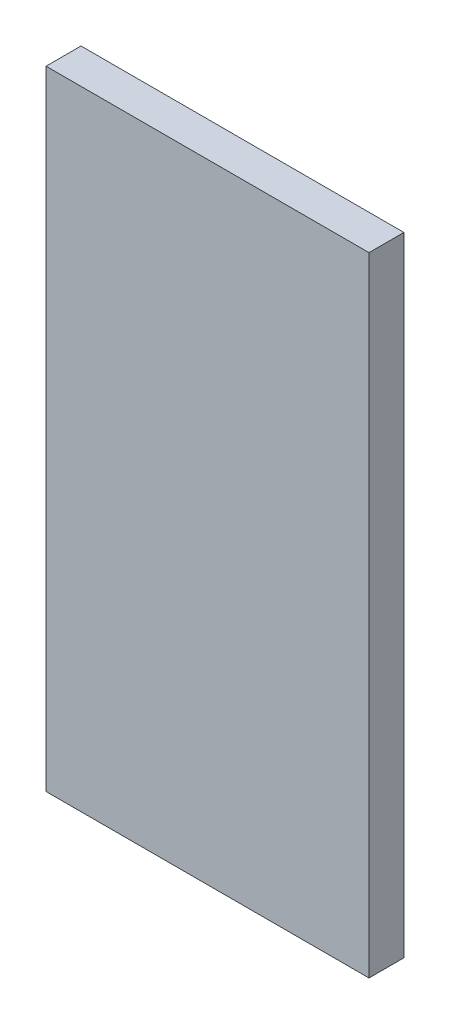
ISO-10303-21;
HEADER;
FILE_DESCRIPTION(('STEP AP214'),'2;1');
FILE_NAME('part.step','',(''),(''),'','','');
FILE_SCHEMA(('AUTOMOTIVE_DESIGN { 1 0 10303 214 1 1 1 1 }'));
ENDSEC;
DATA;
#1=APPLICATION_CONTEXT('core data for automotive mechanical design processes');
#2=APPLICATION_PROTOCOL_DEFINITION('international standard','automotive_design',2000,#1);
#3=PRODUCT_CONTEXT('',#1,'mechanical');
#4=PRODUCT('Part','Part','',(#3));
#5=PRODUCT_RELATED_PRODUCT_CATEGORY('part','',(#4));
#6=PRODUCT_DEFINITION_FORMATION('','',#4);
#7=PRODUCT_DEFINITION_CONTEXT('part definition',#1,'design');
#8=PRODUCT_DEFINITION('design','',#6,#7);
#9=PRODUCT_DEFINITION_SHAPE('','',#8);
#10=(LENGTH_UNIT() NAMED_UNIT(*) SI_UNIT(.MILLI.,.METRE.));
#11=(NAMED_UNIT(*) PLANE_ANGLE_UNIT() SI_UNIT($,.RADIAN.));
#12=(NAMED_UNIT(*) SI_UNIT($,.STERADIAN.) SOLID_ANGLE_UNIT());
#13=UNCERTAINTY_MEASURE_WITH_UNIT(LENGTH_MEASURE(1.E-05),#10,'distance_accuracy_value','');
#14=(GEOMETRIC_REPRESENTATION_CONTEXT(3) GLOBAL_UNCERTAINTY_ASSIGNED_CONTEXT((#13)) GLOBAL_UNIT_ASSIGNED_CONTEXT((#10,
#11,#12)) REPRESENTATION_CONTEXT('',''));
#15=CARTESIAN_POINT('',(0.,0.,0.));
#16=DIRECTION('',(0.,0.,1.));
#17=DIRECTION('',(1.,0.,0.));
#18=AXIS2_PLACEMENT_3D('',#15,#16,#17);
#19=CARTESIAN_POINT('',(0.,0.,7.9));
#20=DIRECTION('',(1.,0.,0.));
#21=DIRECTION('',(0.,0.,-1.));
#22=AXIS2_PLACEMENT_3D('',#19,#20,#21);
#23=PLANE('',#22);
#24=DIRECTION('',(0.,-1.,0.));
#25=VECTOR('',#24,1.);
#26=CARTESIAN_POINT('',(0.,0.,0.));
#27=LINE('',#26,#25);
#28=CARTESIAN_POINT('',(0.,142.,0.));
#29=VERTEX_POINT('',#28);
#30=CARTESIAN_POINT('',(0.,0.,0.));
#31=VERTEX_POINT('',#30);
#32=EDGE_CURVE('E96',#29,#31,#27,.T.);
#33=ORIENTED_EDGE('',*,*,#32,.T.);
#34=DIRECTION('',(0.,0.,-1.));
#35=VECTOR('',#34,1.);
#36=CARTESIAN_POINT('',(0.,0.,7.9));
#37=LINE('',#36,#35);
#38=CARTESIAN_POINT('',(0.,0.,7.9));
#39=VERTEX_POINT('',#38);
#40=EDGE_CURVE('E11',#39,#31,#37,.T.);
#41=ORIENTED_EDGE('',*,*,#40,.F.);
#42=DIRECTION('',(0.,-1.,0.));
#43=VECTOR('',#42,1.);
#44=CARTESIAN_POINT('',(0.,0.,7.9));
#45=LINE('',#44,#43);
#46=CARTESIAN_POINT('',(0.,142.,7.9));
#47=VERTEX_POINT('',#46);
#48=EDGE_CURVE('E84',#47,#39,#45,.T.);
#49=ORIENTED_EDGE('',*,*,#48,.F.);
#50=DIRECTION('',(0.,0.,-1.));
#51=VECTOR('',#50,1.);
#52=CARTESIAN_POINT('',(0.,142.,7.9));
#53=LINE('',#52,#51);
#54=EDGE_CURVE('E92',#47,#29,#53,.T.);
#55=ORIENTED_EDGE('',*,*,#54,.T.);
#56=EDGE_LOOP('',(#33,#41,#49,#55));
#57=FACE_BOUND('',#56,.T.);
#58=ADVANCED_FACE('F33',(#57),#23,.F.);
#59=CARTESIAN_POINT('',(0.,0.,7.9));
#60=DIRECTION('',(0.,1.,0.));
#61=DIRECTION('',(0.,0.,1.));
#62=AXIS2_PLACEMENT_3D('',#59,#60,#61);
#63=PLANE('',#62);
#64=DIRECTION('',(1.,0.,0.));
#65=VECTOR('',#64,1.);
#66=CARTESIAN_POINT('',(0.,0.,0.));
#67=LINE('',#66,#65);
#68=CARTESIAN_POINT('',(73.,0.,0.));
#69=VERTEX_POINT('',#68);
#70=EDGE_CURVE('E88',#31,#69,#67,.T.);
#71=ORIENTED_EDGE('',*,*,#70,.T.);
#72=DIRECTION('',(0.,0.,-1.));
#73=VECTOR('',#72,1.);
#74=CARTESIAN_POINT('',(73.,0.,7.9));
#75=LINE('',#74,#73);
#76=CARTESIAN_POINT('',(73.,0.,7.9));
#77=VERTEX_POINT('',#76);
#78=EDGE_CURVE('E41',#77,#69,#75,.T.);
#79=ORIENTED_EDGE('',*,*,#78,.F.);
#80=DIRECTION('',(1.,0.,0.));
#81=VECTOR('',#80,1.);
#82=CARTESIAN_POINT('',(0.,0.,7.9));
#83=LINE('',#82,#81);
#84=EDGE_CURVE('E79',#39,#77,#83,.T.);
#85=ORIENTED_EDGE('',*,*,#84,.F.);
#86=ORIENTED_EDGE('',*,*,#40,.T.);
#87=EDGE_LOOP('',(#71,#79,#85,#86));
#88=FACE_BOUND('',#87,.T.);
#89=ADVANCED_FACE('F87',(#88),#63,.F.);
#90=CARTESIAN_POINT('',(73.,0.,7.9));
#91=DIRECTION('',(-1.,0.,0.));
#92=DIRECTION('',(0.,0.,1.));
#93=AXIS2_PLACEMENT_3D('',#90,#91,#92);
#94=PLANE('',#93);
#95=DIRECTION('',(0.,1.,0.));
#96=VECTOR('',#95,1.);
#97=CARTESIAN_POINT('',(73.,0.,0.));
#98=LINE('',#97,#96);
#99=CARTESIAN_POINT('',(73.,142.,0.));
#100=VERTEX_POINT('',#99);
#101=EDGE_CURVE('E66',#69,#100,#98,.T.);
#102=ORIENTED_EDGE('',*,*,#101,.T.);
#103=DIRECTION('',(0.,0.,-1.));
#104=VECTOR('',#103,1.);
#105=CARTESIAN_POINT('',(73.,142.,7.9));
#106=LINE('',#105,#104);
#107=CARTESIAN_POINT('',(73.,142.,7.9));
#108=VERTEX_POINT('',#107);
#109=EDGE_CURVE('E89',#108,#100,#106,.T.);
#110=ORIENTED_EDGE('',*,*,#109,.F.);
#111=DIRECTION('',(0.,1.,0.));
#112=VECTOR('',#111,1.);
#113=CARTESIAN_POINT('',(73.,0.,7.9));
#114=LINE('',#113,#112);
#115=EDGE_CURVE('E82',#77,#108,#114,.T.);
#116=ORIENTED_EDGE('',*,*,#115,.F.);
#117=ORIENTED_EDGE('',*,*,#78,.T.);
#118=EDGE_LOOP('',(#102,#110,#116,#117));
#119=FACE_BOUND('',#118,.T.);
#120=ADVANCED_FACE('F90',(#119),#94,.F.);
#121=CARTESIAN_POINT('',(0.,142.,7.9));
#122=DIRECTION('',(0.,-1.,0.));
#123=DIRECTION('',(0.,0.,-1.));
#124=AXIS2_PLACEMENT_3D('',#121,#122,#123);
#125=PLANE('',#124);
#126=DIRECTION('',(-1.,0.,0.));
#127=VECTOR('',#126,1.);
#128=CARTESIAN_POINT('',(0.,142.,0.));
#129=LINE('',#128,#127);
#130=EDGE_CURVE('E72',#100,#29,#129,.T.);
#131=ORIENTED_EDGE('',*,*,#130,.T.);
#132=ORIENTED_EDGE('',*,*,#54,.F.);
#133=DIRECTION('',(-1.,0.,0.));
#134=VECTOR('',#133,1.);
#135=CARTESIAN_POINT('',(0.,142.,7.9));
#136=LINE('',#135,#134);
#137=EDGE_CURVE('E49',#108,#47,#136,.T.);
#138=ORIENTED_EDGE('',*,*,#137,.F.);
#139=ORIENTED_EDGE('',*,*,#109,.T.);
#140=EDGE_LOOP('',(#131,#132,#138,#139));
#141=FACE_BOUND('',#140,.T.);
#142=ADVANCED_FACE('F103',(#141),#125,.F.);
#143=CARTESIAN_POINT('',(0.,0.,7.9));
#144=DIRECTION('',(0.,0.,-1.));
#145=DIRECTION('',(-1.,0.,0.));
#146=AXIS2_PLACEMENT_3D('',#143,#144,#145);
#147=PLANE('',#146);
#148=ORIENTED_EDGE('',*,*,#48,.T.);
#149=ORIENTED_EDGE('',*,*,#84,.T.);
#150=ORIENTED_EDGE('',*,*,#115,.T.);
#151=ORIENTED_EDGE('',*,*,#137,.T.);
#152=EDGE_LOOP('',(#148,#149,#150,#151));
#153=FACE_BOUND('',#152,.T.);
#154=ADVANCED_FACE('F80',(#153),#147,.F.);
#155=CARTESIAN_POINT('',(0.,0.,0.));
#156=DIRECTION('',(0.,0.,-1.));
#157=DIRECTION('',(-1.,0.,0.));
#158=AXIS2_PLACEMENT_3D('',#155,#156,#157);
#159=PLANE('',#158);
#160=ORIENTED_EDGE('',*,*,#32,.F.);
#161=ORIENTED_EDGE('',*,*,#130,.F.);
#162=ORIENTED_EDGE('',*,*,#101,.F.);
#163=ORIENTED_EDGE('',*,*,#70,.F.);
#164=EDGE_LOOP('',(#160,#161,#162,#163));
#165=FACE_BOUND('',#164,.T.);
#166=ADVANCED_FACE('F106',(#165),#159,.T.);
#167=CLOSED_SHELL('',(#58,#89,#120,#142,#154,#166));
#168=MANIFOLD_SOLID_BREP('B2',#167);
#169=ADVANCED_BREP_SHAPE_REPRESENTATION('',(#18,#168),#14);
#170=SHAPE_DEFINITION_REPRESENTATION(#9,#169);
ENDSEC;
END-ISO-10303-21;
